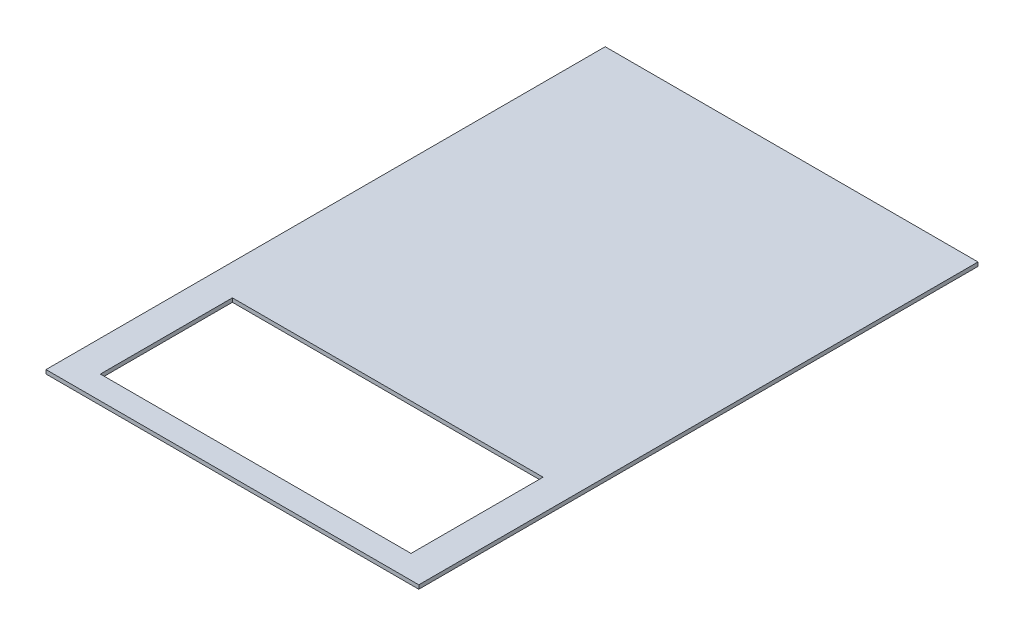
ISO-10303-21;
HEADER;
FILE_DESCRIPTION(('STEP AP214'),'2;1');
FILE_NAME('part.step','',(''),(''),'','','');
FILE_SCHEMA(('AUTOMOTIVE_DESIGN { 1 0 10303 214 1 1 1 1 }'));
ENDSEC;
DATA;
#1=APPLICATION_CONTEXT('core data for automotive mechanical design processes');
#2=APPLICATION_PROTOCOL_DEFINITION('international standard','automotive_design',2000,#1);
#3=PRODUCT_CONTEXT('',#1,'mechanical');
#4=PRODUCT('Part','Part','',(#3));
#5=PRODUCT_RELATED_PRODUCT_CATEGORY('part','',(#4));
#6=PRODUCT_DEFINITION_FORMATION('','',#4);
#7=PRODUCT_DEFINITION_CONTEXT('part definition',#1,'design');
#8=PRODUCT_DEFINITION('design','',#6,#7);
#9=PRODUCT_DEFINITION_SHAPE('','',#8);
#10=(LENGTH_UNIT() NAMED_UNIT(*) SI_UNIT(.MILLI.,.METRE.));
#11=(NAMED_UNIT(*) PLANE_ANGLE_UNIT() SI_UNIT($,.RADIAN.));
#12=(NAMED_UNIT(*) SI_UNIT($,.STERADIAN.) SOLID_ANGLE_UNIT());
#13=UNCERTAINTY_MEASURE_WITH_UNIT(LENGTH_MEASURE(1.E-05),#10,'distance_accuracy_value','');
#14=(GEOMETRIC_REPRESENTATION_CONTEXT(3) GLOBAL_UNCERTAINTY_ASSIGNED_CONTEXT((#13)) GLOBAL_UNIT_ASSIGNED_CONTEXT((#10,
#11,#12)) REPRESENTATION_CONTEXT('',''));
#15=CARTESIAN_POINT('',(0.,0.,0.));
#16=DIRECTION('',(0.,0.,1.));
#17=DIRECTION('',(1.,0.,0.));
#18=AXIS2_PLACEMENT_3D('',#15,#16,#17);
#19=CARTESIAN_POINT('',(304.8,6.35,457.2));
#20=DIRECTION('',(-1.,0.,0.));
#21=DIRECTION('',(0.,0.,1.));
#22=AXIS2_PLACEMENT_3D('',#19,#20,#21);
#23=PLANE('',#22);
#24=DIRECTION('',(0.,0.,-1.));
#25=VECTOR('',#24,1.);
#26=CARTESIAN_POINT('',(304.8,0.,457.2));
#27=LINE('',#26,#25);
#28=CARTESIAN_POINT('',(304.8,0.,457.2));
#29=VERTEX_POINT('',#28);
#30=CARTESIAN_POINT('',(304.8,0.,-457.2));
#31=VERTEX_POINT('',#30);
#32=EDGE_CURVE('E150',#29,#31,#27,.T.);
#33=ORIENTED_EDGE('',*,*,#32,.T.);
#34=DIRECTION('',(0.,-1.,0.));
#35=VECTOR('',#34,1.);
#36=CARTESIAN_POINT('',(304.8,6.35,-457.2));
#37=LINE('',#36,#35);
#38=CARTESIAN_POINT('',(304.8,6.35,-457.2));
#39=VERTEX_POINT('',#38);
#40=EDGE_CURVE('E11',#39,#31,#37,.T.);
#41=ORIENTED_EDGE('',*,*,#40,.F.);
#42=DIRECTION('',(0.,0.,-1.));
#43=VECTOR('',#42,1.);
#44=CARTESIAN_POINT('',(304.8,6.35,457.2));
#45=LINE('',#44,#43);
#46=CARTESIAN_POINT('',(304.8,6.35,457.2));
#47=VERTEX_POINT('',#46);
#48=EDGE_CURVE('E156',#47,#39,#45,.T.);
#49=ORIENTED_EDGE('',*,*,#48,.F.);
#50=DIRECTION('',(0.,-1.,0.));
#51=VECTOR('',#50,1.);
#52=CARTESIAN_POINT('',(304.8,6.35,457.2));
#53=LINE('',#52,#51);
#54=EDGE_CURVE('E170',#47,#29,#53,.T.);
#55=ORIENTED_EDGE('',*,*,#54,.T.);
#56=EDGE_LOOP('',(#33,#41,#49,#55));
#57=FACE_BOUND('',#56,.T.);
#58=ADVANCED_FACE('F42',(#57),#23,.F.);
#59=CARTESIAN_POINT('',(-304.8,6.35,-457.2));
#60=DIRECTION('',(0.,0.,1.));
#61=DIRECTION('',(1.,0.,0.));
#62=AXIS2_PLACEMENT_3D('',#59,#60,#61);
#63=PLANE('',#62);
#64=DIRECTION('',(-1.,0.,0.));
#65=VECTOR('',#64,1.);
#66=CARTESIAN_POINT('',(-304.8,0.,-457.2));
#67=LINE('',#66,#65);
#68=CARTESIAN_POINT('',(-304.8,0.,-457.2));
#69=VERTEX_POINT('',#68);
#70=EDGE_CURVE('E174',#31,#69,#67,.T.);
#71=ORIENTED_EDGE('',*,*,#70,.T.);
#72=DIRECTION('',(0.,-1.,0.));
#73=VECTOR('',#72,1.);
#74=CARTESIAN_POINT('',(-304.8,6.35,-457.2));
#75=LINE('',#74,#73);
#76=CARTESIAN_POINT('',(-304.8,6.35,-457.2));
#77=VERTEX_POINT('',#76);
#78=EDGE_CURVE('E50',#77,#69,#75,.T.);
#79=ORIENTED_EDGE('',*,*,#78,.F.);
#80=DIRECTION('',(-1.,0.,0.));
#81=VECTOR('',#80,1.);
#82=CARTESIAN_POINT('',(-304.8,6.35,-457.2));
#83=LINE('',#82,#81);
#84=EDGE_CURVE('E160',#39,#77,#83,.T.);
#85=ORIENTED_EDGE('',*,*,#84,.F.);
#86=ORIENTED_EDGE('',*,*,#40,.T.);
#87=EDGE_LOOP('',(#71,#79,#85,#86));
#88=FACE_BOUND('',#87,.T.);
#89=ADVANCED_FACE('F208',(#88),#63,.F.);
#90=CARTESIAN_POINT('',(-304.8,6.35,457.2));
#91=DIRECTION('',(1.,0.,0.));
#92=DIRECTION('',(0.,0.,-1.));
#93=AXIS2_PLACEMENT_3D('',#90,#91,#92);
#94=PLANE('',#93);
#95=DIRECTION('',(0.,0.,1.));
#96=VECTOR('',#95,1.);
#97=CARTESIAN_POINT('',(-304.8,0.,457.2));
#98=LINE('',#97,#96);
#99=CARTESIAN_POINT('',(-304.8,0.,457.2));
#100=VERTEX_POINT('',#99);
#101=EDGE_CURVE('E177',#69,#100,#98,.T.);
#102=ORIENTED_EDGE('',*,*,#101,.T.);
#103=DIRECTION('',(0.,-1.,0.));
#104=VECTOR('',#103,1.);
#105=CARTESIAN_POINT('',(-304.8,6.35,457.2));
#106=LINE('',#105,#104);
#107=CARTESIAN_POINT('',(-304.8,6.35,457.2));
#108=VERTEX_POINT('',#107);
#109=EDGE_CURVE('E185',#108,#100,#106,.T.);
#110=ORIENTED_EDGE('',*,*,#109,.F.);
#111=DIRECTION('',(0.,0.,1.));
#112=VECTOR('',#111,1.);
#113=CARTESIAN_POINT('',(-304.8,6.35,457.2));
#114=LINE('',#113,#112);
#115=EDGE_CURVE('E164',#77,#108,#114,.T.);
#116=ORIENTED_EDGE('',*,*,#115,.F.);
#117=ORIENTED_EDGE('',*,*,#78,.T.);
#118=EDGE_LOOP('',(#102,#110,#116,#117));
#119=FACE_BOUND('',#118,.T.);
#120=ADVANCED_FACE('F194',(#119),#94,.F.);
#121=CARTESIAN_POINT('',(-304.8,6.35,457.2));
#122=DIRECTION('',(0.,0.,-1.));
#123=DIRECTION('',(-1.,0.,0.));
#124=AXIS2_PLACEMENT_3D('',#121,#122,#123);
#125=PLANE('',#124);
#126=DIRECTION('',(1.,0.,0.));
#127=VECTOR('',#126,1.);
#128=CARTESIAN_POINT('',(-304.8,0.,457.2));
#129=LINE('',#128,#127);
#130=EDGE_CURVE('E161',#100,#29,#129,.T.);
#131=ORIENTED_EDGE('',*,*,#130,.T.);
#132=ORIENTED_EDGE('',*,*,#54,.F.);
#133=DIRECTION('',(1.,0.,0.));
#134=VECTOR('',#133,1.);
#135=CARTESIAN_POINT('',(-304.8,6.35,457.2));
#136=LINE('',#135,#134);
#137=EDGE_CURVE('E167',#108,#47,#136,.T.);
#138=ORIENTED_EDGE('',*,*,#137,.F.);
#139=ORIENTED_EDGE('',*,*,#109,.T.);
#140=EDGE_LOOP('',(#131,#132,#138,#139));
#141=FACE_BOUND('',#140,.T.);
#142=ADVANCED_FACE('F201',(#141),#125,.F.);
#143=CARTESIAN_POINT('',(0.,6.35,0.));
#144=DIRECTION('',(0.,-1.,0.));
#145=DIRECTION('',(0.,0.,-1.));
#146=AXIS2_PLACEMENT_3D('',#143,#144,#145);
#147=PLANE('',#146);
#148=DIRECTION('',(-1.,0.,0.));
#149=VECTOR('',#148,1.);
#150=CARTESIAN_POINT('',(-254.,6.35,203.2));
#151=LINE('',#150,#149);
#152=CARTESIAN_POINT('',(254.,6.35,203.2));
#153=VERTEX_POINT('',#152);
#154=CARTESIAN_POINT('',(-254.,6.35,203.2));
#155=VERTEX_POINT('',#154);
#156=EDGE_CURVE('E141',#153,#155,#151,.T.);
#157=ORIENTED_EDGE('',*,*,#156,.F.);
#158=DIRECTION('',(0.,0.,-1.));
#159=VECTOR('',#158,1.);
#160=CARTESIAN_POINT('',(254.,6.35,419.1));
#161=LINE('',#160,#159);
#162=CARTESIAN_POINT('',(254.,6.35,419.1));
#163=VERTEX_POINT('',#162);
#164=EDGE_CURVE('E57',#163,#153,#161,.T.);
#165=ORIENTED_EDGE('',*,*,#164,.F.);
#166=DIRECTION('',(1.,0.,0.));
#167=VECTOR('',#166,1.);
#168=CARTESIAN_POINT('',(-254.,6.35,419.1));
#169=LINE('',#168,#167);
#170=CARTESIAN_POINT('',(-254.,6.35,419.1));
#171=VERTEX_POINT('',#170);
#172=EDGE_CURVE('E128',#171,#163,#169,.T.);
#173=ORIENTED_EDGE('',*,*,#172,.F.);
#174=DIRECTION('',(0.,0.,1.));
#175=VECTOR('',#174,1.);
#176=CARTESIAN_POINT('',(-254.,6.35,419.1));
#177=LINE('',#176,#175);
#178=EDGE_CURVE('E132',#155,#171,#177,.T.);
#179=ORIENTED_EDGE('',*,*,#178,.F.);
#180=EDGE_LOOP('',(#157,#165,#173,#179));
#181=FACE_BOUND('',#180,.T.);
#182=ORIENTED_EDGE('',*,*,#48,.T.);
#183=ORIENTED_EDGE('',*,*,#84,.T.);
#184=ORIENTED_EDGE('',*,*,#115,.T.);
#185=ORIENTED_EDGE('',*,*,#137,.T.);
#186=EDGE_LOOP('',(#182,#183,#184,#185));
#187=FACE_BOUND('',#186,.T.);
#188=ADVANCED_FACE('F207',(#181,#187),#147,.F.);
#189=CARTESIAN_POINT('',(0.,0.,0.));
#190=DIRECTION('',(0.,-1.,0.));
#191=DIRECTION('',(0.,0.,-1.));
#192=AXIS2_PLACEMENT_3D('',#189,#190,#191);
#193=PLANE('',#192);
#194=DIRECTION('',(0.,0.,-1.));
#195=VECTOR('',#194,1.);
#196=CARTESIAN_POINT('',(254.,0.,419.1));
#197=LINE('',#196,#195);
#198=CARTESIAN_POINT('',(254.,0.,419.1));
#199=VERTEX_POINT('',#198);
#200=CARTESIAN_POINT('',(254.,0.,203.2));
#201=VERTEX_POINT('',#200);
#202=EDGE_CURVE('E109',#199,#201,#197,.T.);
#203=ORIENTED_EDGE('',*,*,#202,.T.);
#204=DIRECTION('',(-1.,0.,0.));
#205=VECTOR('',#204,1.);
#206=CARTESIAN_POINT('',(-254.,0.,203.2));
#207=LINE('',#206,#205);
#208=CARTESIAN_POINT('',(-254.,0.,203.2));
#209=VERTEX_POINT('',#208);
#210=EDGE_CURVE('E119',#201,#209,#207,.T.);
#211=ORIENTED_EDGE('',*,*,#210,.T.);
#212=DIRECTION('',(0.,0.,1.));
#213=VECTOR('',#212,1.);
#214=CARTESIAN_POINT('',(-254.,0.,419.1));
#215=LINE('',#214,#213);
#216=CARTESIAN_POINT('',(-254.,0.,419.1));
#217=VERTEX_POINT('',#216);
#218=EDGE_CURVE('E65',#209,#217,#215,.T.);
#219=ORIENTED_EDGE('',*,*,#218,.T.);
#220=DIRECTION('',(1.,0.,0.));
#221=VECTOR('',#220,1.);
#222=CARTESIAN_POINT('',(-254.,0.,419.1));
#223=LINE('',#222,#221);
#224=EDGE_CURVE('E116',#217,#199,#223,.T.);
#225=ORIENTED_EDGE('',*,*,#224,.T.);
#226=EDGE_LOOP('',(#203,#211,#219,#225));
#227=FACE_BOUND('',#226,.T.);
#228=ORIENTED_EDGE('',*,*,#32,.F.);
#229=ORIENTED_EDGE('',*,*,#130,.F.);
#230=ORIENTED_EDGE('',*,*,#101,.F.);
#231=ORIENTED_EDGE('',*,*,#70,.F.);
#232=EDGE_LOOP('',(#228,#229,#230,#231));
#233=FACE_BOUND('',#232,.T.);
#234=ADVANCED_FACE('F124',(#227,#233),#193,.T.);
#235=CARTESIAN_POINT('',(254.,0.,419.1));
#236=DIRECTION('',(1.,0.,0.));
#237=DIRECTION('',(0.,0.,-1.));
#238=AXIS2_PLACEMENT_3D('',#235,#236,#237);
#239=PLANE('',#238);
#240=ORIENTED_EDGE('',*,*,#164,.T.);
#241=DIRECTION('',(0.,1.,0.));
#242=VECTOR('',#241,1.);
#243=CARTESIAN_POINT('',(254.,0.,203.2));
#244=LINE('',#243,#242);
#245=EDGE_CURVE('E105',#201,#153,#244,.T.);
#246=ORIENTED_EDGE('',*,*,#245,.F.);
#247=ORIENTED_EDGE('',*,*,#202,.F.);
#248=DIRECTION('',(0.,1.,0.));
#249=VECTOR('',#248,1.);
#250=CARTESIAN_POINT('',(254.,0.,419.1));
#251=LINE('',#250,#249);
#252=EDGE_CURVE('E147',#199,#163,#251,.T.);
#253=ORIENTED_EDGE('',*,*,#252,.T.);
#254=EDGE_LOOP('',(#240,#246,#247,#253));
#255=FACE_BOUND('',#254,.T.);
#256=ADVANCED_FACE('F107',(#255),#239,.F.);
#257=CARTESIAN_POINT('',(-254.,0.,419.1));
#258=DIRECTION('',(0.,0.,1.));
#259=DIRECTION('',(1.,0.,0.));
#260=AXIS2_PLACEMENT_3D('',#257,#258,#259);
#261=PLANE('',#260);
#262=ORIENTED_EDGE('',*,*,#172,.T.);
#263=ORIENTED_EDGE('',*,*,#252,.F.);
#264=ORIENTED_EDGE('',*,*,#224,.F.);
#265=DIRECTION('',(0.,1.,0.));
#266=VECTOR('',#265,1.);
#267=CARTESIAN_POINT('',(-254.,0.,419.1));
#268=LINE('',#267,#266);
#269=EDGE_CURVE('E151',#217,#171,#268,.T.);
#270=ORIENTED_EDGE('',*,*,#269,.T.);
#271=EDGE_LOOP('',(#262,#263,#264,#270));
#272=FACE_BOUND('',#271,.T.);
#273=ADVANCED_FACE('F225',(#272),#261,.F.);
#274=CARTESIAN_POINT('',(-254.,0.,419.1));
#275=DIRECTION('',(-1.,0.,0.));
#276=DIRECTION('',(0.,0.,1.));
#277=AXIS2_PLACEMENT_3D('',#274,#275,#276);
#278=PLANE('',#277);
#279=ORIENTED_EDGE('',*,*,#178,.T.);
#280=ORIENTED_EDGE('',*,*,#269,.F.);
#281=ORIENTED_EDGE('',*,*,#218,.F.);
#282=DIRECTION('',(0.,1.,0.));
#283=VECTOR('',#282,1.);
#284=CARTESIAN_POINT('',(-254.,0.,203.2));
#285=LINE('',#284,#283);
#286=EDGE_CURVE('E115',#209,#155,#285,.T.);
#287=ORIENTED_EDGE('',*,*,#286,.T.);
#288=EDGE_LOOP('',(#279,#280,#281,#287));
#289=FACE_BOUND('',#288,.T.);
#290=ADVANCED_FACE('F228',(#289),#278,.F.);
#291=CARTESIAN_POINT('',(-254.,0.,203.2));
#292=DIRECTION('',(0.,0.,-1.));
#293=DIRECTION('',(-1.,0.,0.));
#294=AXIS2_PLACEMENT_3D('',#291,#292,#293);
#295=PLANE('',#294);
#296=ORIENTED_EDGE('',*,*,#156,.T.);
#297=ORIENTED_EDGE('',*,*,#286,.F.);
#298=ORIENTED_EDGE('',*,*,#210,.F.);
#299=ORIENTED_EDGE('',*,*,#245,.T.);
#300=EDGE_LOOP('',(#296,#297,#298,#299));
#301=FACE_BOUND('',#300,.T.);
#302=ADVANCED_FACE('F120',(#301),#295,.F.);
#303=CLOSED_SHELL('',(#58,#89,#120,#142,#188,#234,#256,#273,#290,#302));
#304=MANIFOLD_SOLID_BREP('B2',#303);
#305=ADVANCED_BREP_SHAPE_REPRESENTATION('',(#18,#304),#14);
#306=SHAPE_DEFINITION_REPRESENTATION(#9,#305);
ENDSEC;
END-ISO-10303-21;
